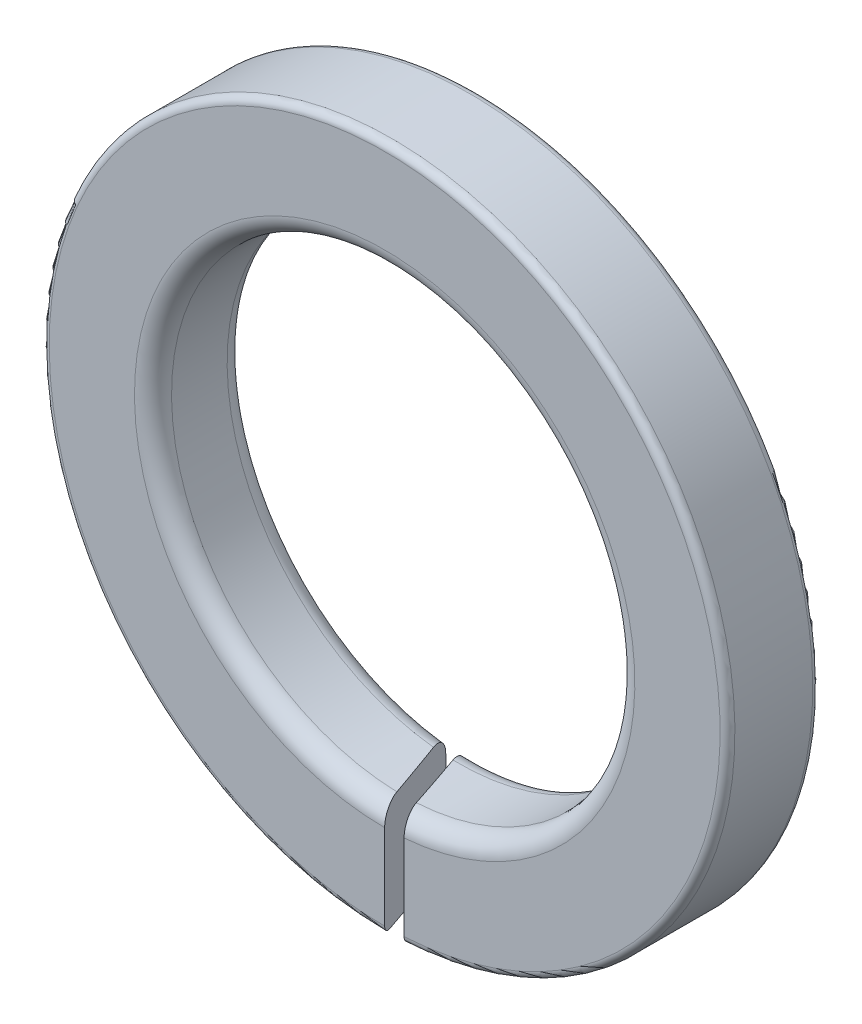
ISO-10303-21;
HEADER;
FILE_DESCRIPTION(('STEP AP214'),'2;1');
FILE_NAME('part.step','',(''),(''),'','','');
FILE_SCHEMA(('AUTOMOTIVE_DESIGN { 1 0 10303 214 1 1 1 1 }'));
ENDSEC;
DATA;
#1=APPLICATION_CONTEXT('core data for automotive mechanical design processes');
#2=APPLICATION_PROTOCOL_DEFINITION('international standard','automotive_design',2000,#1);
#3=PRODUCT_CONTEXT('',#1,'mechanical');
#4=PRODUCT('Part','Part','',(#3));
#5=PRODUCT_RELATED_PRODUCT_CATEGORY('part','',(#4));
#6=PRODUCT_DEFINITION_FORMATION('','',#4);
#7=PRODUCT_DEFINITION_CONTEXT('part definition',#1,'design');
#8=PRODUCT_DEFINITION('design','',#6,#7);
#9=PRODUCT_DEFINITION_SHAPE('','',#8);
#10=(LENGTH_UNIT() NAMED_UNIT(*) SI_UNIT(.MILLI.,.METRE.));
#11=(NAMED_UNIT(*) PLANE_ANGLE_UNIT() SI_UNIT($,.RADIAN.));
#12=(NAMED_UNIT(*) SI_UNIT($,.STERADIAN.) SOLID_ANGLE_UNIT());
#13=UNCERTAINTY_MEASURE_WITH_UNIT(LENGTH_MEASURE(1.E-05),#10,'distance_accuracy_value','');
#14=(GEOMETRIC_REPRESENTATION_CONTEXT(3) GLOBAL_UNCERTAINTY_ASSIGNED_CONTEXT((#13)) GLOBAL_UNIT_ASSIGNED_CONTEXT((#10,
#11,#12)) REPRESENTATION_CONTEXT('',''));
#15=CARTESIAN_POINT('',(0.,0.,0.));
#16=DIRECTION('',(0.,0.,1.));
#17=DIRECTION('',(1.,0.,0.));
#18=AXIS2_PLACEMENT_3D('',#15,#16,#17);
#19=CARTESIAN_POINT('',(0.,0.,2.5));
#20=DIRECTION('',(0.,0.,1.));
#21=DIRECTION('',(1.,0.,0.));
#22=AXIS2_PLACEMENT_3D('',#19,#20,#21);
#23=PLANE('',#22);
#24=DIRECTION('',(0.,1.,0.));
#25=VECTOR('',#24,1.);
#26=CARTESIAN_POINT('',(0.524617444503619,-9.25,2.5));
#27=LINE('',#26,#25);
#28=CARTESIAN_POINT('',(0.524617444503619,-9.03478148805617,2.5));
#29=VERTEX_POINT('',#28);
#30=CARTESIAN_POINT('',(0.524617444503619,-6.72958219631223,2.5));
#31=VERTEX_POINT('',#30);
#32=EDGE_CURVE('E107',#29,#31,#27,.T.);
#33=ORIENTED_EDGE('',*,*,#32,.F.);
#34=CARTESIAN_POINT('',(0.,0.,2.5));
#35=DIRECTION('',(0.,0.,1.));
#36=DIRECTION('',(1.,0.,0.));
#37=AXIS2_PLACEMENT_3D('',#34,#35,#36);
#38=CIRCLE('',#37,9.05);
#39=CARTESIAN_POINT('',(0.,-9.05,2.5));
#40=VERTEX_POINT('',#39);
#41=EDGE_CURVE('E169',#29,#40,#38,.T.);
#42=ORIENTED_EDGE('',*,*,#41,.T.);
#43=DIRECTION('',(0.,1.,0.));
#44=VECTOR('',#43,1.);
#45=CARTESIAN_POINT('',(0.,-9.25,2.5));
#46=LINE('',#45,#44);
#47=CARTESIAN_POINT('',(0.,-6.75,2.5));
#48=VERTEX_POINT('',#47);
#49=EDGE_CURVE('E204',#40,#48,#46,.T.);
#50=ORIENTED_EDGE('',*,*,#49,.T.);
#51=CARTESIAN_POINT('',(0.,0.,2.5));
#52=DIRECTION('',(0.,0.,1.));
#53=DIRECTION('',(1.,0.,0.));
#54=AXIS2_PLACEMENT_3D('',#51,#52,#53);
#55=CIRCLE('',#54,6.75);
#56=EDGE_CURVE('E202',#48,#31,#55,.F.);
#57=ORIENTED_EDGE('',*,*,#56,.T.);
#58=EDGE_LOOP('',(#33,#42,#50,#57));
#59=FACE_BOUND('',#58,.T.);
#60=ADVANCED_FACE('F36',(#59),#23,.T.);
#61=CARTESIAN_POINT('',(0.,0.,0.));
#62=DIRECTION('',(0.,0.,1.));
#63=DIRECTION('',(1.,0.,0.));
#64=AXIS2_PLACEMENT_3D('',#61,#62,#63);
#65=PLANE('',#64);
#66=DIRECTION('',(0.,1.,0.));
#67=VECTOR('',#66,1.);
#68=CARTESIAN_POINT('',(-0.851663401323122,-9.25,0.));
#69=LINE('',#68,#67);
#70=CARTESIAN_POINT('',(-0.851663401323122,-9.00983737094331,0.));
#71=VERTEX_POINT('',#70);
#72=CARTESIAN_POINT('',(-0.851663401323122,-6.69605626102759,0.));
#73=VERTEX_POINT('',#72);
#74=EDGE_CURVE('E234',#71,#73,#69,.T.);
#75=ORIENTED_EDGE('',*,*,#74,.F.);
#76=CARTESIAN_POINT('',(0.,0.,0.));
#77=DIRECTION('',(0.,0.,1.));
#78=DIRECTION('',(1.,0.,0.));
#79=AXIS2_PLACEMENT_3D('',#76,#77,#78);
#80=CIRCLE('',#79,9.05);
#81=CARTESIAN_POINT('',(-0.327045956819503,-9.04408872922684,0.));
#82=VERTEX_POINT('',#81);
#83=EDGE_CURVE('E11',#71,#82,#80,.F.);
#84=ORIENTED_EDGE('',*,*,#83,.T.);
#85=DIRECTION('',(0.,1.,0.));
#86=VECTOR('',#85,1.);
#87=CARTESIAN_POINT('',(-0.327045956819503,-9.25,0.));
#88=LINE('',#87,#86);
#89=CARTESIAN_POINT('',(-0.327045956819503,-6.74207245156324,0.));
#90=VERTEX_POINT('',#89);
#91=EDGE_CURVE('E203',#82,#90,#88,.T.);
#92=ORIENTED_EDGE('',*,*,#91,.T.);
#93=CARTESIAN_POINT('',(0.,0.,0.));
#94=DIRECTION('',(0.,0.,1.));
#95=DIRECTION('',(1.,0.,0.));
#96=AXIS2_PLACEMENT_3D('',#93,#94,#95);
#97=CIRCLE('',#96,6.75);
#98=EDGE_CURVE('E112',#90,#73,#97,.T.);
#99=ORIENTED_EDGE('',*,*,#98,.T.);
#100=EDGE_LOOP('',(#75,#84,#92,#99));
#101=FACE_BOUND('',#100,.T.);
#102=ADVANCED_FACE('F226',(#101),#65,.F.);
#103=CARTESIAN_POINT('',(0.,0.,2.5));
#104=DIRECTION('',(0.,0.,-1.));
#105=DIRECTION('',(-1.,0.,0.));
#106=AXIS2_PLACEMENT_3D('',#103,#104,#105);
#107=CYLINDRICAL_SURFACE('',#106,9.25);
#108=CARTESIAN_POINT('',(0.,0.,2.5));
#109=DIRECTION('',(-0.946580627851337,0.,0.322467230856978));
#110=DIRECTION('',(-0.322467230856978,0.,-0.946580627851337));
#111=AXIS2_PLACEMENT_3D('',#108,#109,#110);
#112=ELLIPSE('',#111,28.6850852268539,9.25);
#113=CARTESIAN_POINT('',(-0.783530329217273,-9.21675540649727,0.199999999999998));
#114=VERTEX_POINT('',#113);
#115=CARTESIAN_POINT('',(-0.0681330721058493,-9.24974907143353,2.3));
#116=VERTEX_POINT('',#115);
#117=EDGE_CURVE('E242',#114,#116,#112,.T.);
#118=ORIENTED_EDGE('',*,*,#117,.T.);
#119=CARTESIAN_POINT('',(0.,0.,2.3));
#120=DIRECTION('',(0.,0.,1.));
#121=DIRECTION('',(1.,0.,0.));
#122=AXIS2_PLACEMENT_3D('',#119,#120,#121);
#123=CIRCLE('',#122,9.25);
#124=CARTESIAN_POINT('',(0.45648437239777,-9.2387294590629,2.3));
#125=VERTEX_POINT('',#124);
#126=EDGE_CURVE('E189',#116,#125,#123,.F.);
#127=ORIENTED_EDGE('',*,*,#126,.T.);
#128=CARTESIAN_POINT('',(0.,0.,0.960021166553044));
#129=DIRECTION('',(0.946580627851337,0.,-0.322467230856978));
#130=DIRECTION('',(-0.322467230856978,0.,-0.946580627851337));
#131=AXIS2_PLACEMENT_3D('',#128,#129,#130);
#132=ELLIPSE('',#131,28.6850852268539,9.25);
#133=CARTESIAN_POINT('',(-0.258912884713652,-9.24637572879932,0.200000000000003));
#134=VERTEX_POINT('',#133);
#135=EDGE_CURVE('E195',#125,#134,#132,.T.);
#136=ORIENTED_EDGE('',*,*,#135,.T.);
#137=CARTESIAN_POINT('',(0.,0.,0.2));
#138=DIRECTION('',(0.,0.,1.));
#139=DIRECTION('',(1.,0.,0.));
#140=AXIS2_PLACEMENT_3D('',#137,#138,#139);
#141=CIRCLE('',#140,9.25);
#142=EDGE_CURVE('E239',#134,#114,#141,.T.);
#143=ORIENTED_EDGE('',*,*,#142,.T.);
#144=EDGE_LOOP('',(#118,#127,#136,#143));
#145=FACE_BOUND('',#144,.T.);
#146=ADVANCED_FACE('F38',(#145),#107,.T.);
#147=CARTESIAN_POINT('',(0.,0.,2.5));
#148=DIRECTION('',(0.,0.,-1.));
#149=DIRECTION('',(-1.,0.,0.));
#150=AXIS2_PLACEMENT_3D('',#147,#148,#149);
#151=CYLINDRICAL_SURFACE('',#150,6.25);
#152=CARTESIAN_POINT('',(0.,0.,0.960021166553044));
#153=DIRECTION('',(0.946580627851337,0.,-0.322467230856978));
#154=DIRECTION('',(-0.322467230856978,0.,-0.946580627851337));
#155=AXIS2_PLACEMENT_3D('',#152,#153,#154);
#156=ELLIPSE('',#155,19.3818143424689,6.25);
#157=CARTESIAN_POINT('',(0.354284764238996,-6.23995050507839,2.));
#158=VERTEX_POINT('',#157);
#159=CARTESIAN_POINT('',(-0.156713276554875,-6.24803496700774,0.50000000000001));
#160=VERTEX_POINT('',#159);
#161=EDGE_CURVE('E104',#158,#160,#156,.T.);
#162=ORIENTED_EDGE('',*,*,#161,.F.);
#163=CARTESIAN_POINT('',(0.,0.,2.));
#164=DIRECTION('',(0.,0.,1.));
#165=DIRECTION('',(1.,0.,0.));
#166=AXIS2_PLACEMENT_3D('',#163,#164,#165);
#167=CIRCLE('',#166,6.25);
#168=CARTESIAN_POINT('',(-0.170332680264625,-6.24767851109785,2.));
#169=VERTEX_POINT('',#168);
#170=EDGE_CURVE('E119',#158,#169,#167,.T.);
#171=ORIENTED_EDGE('',*,*,#170,.T.);
#172=CARTESIAN_POINT('',(0.,0.,2.5));
#173=DIRECTION('',(-0.946580627851337,0.,0.322467230856978));
#174=DIRECTION('',(-0.322467230856978,0.,-0.946580627851337));
#175=AXIS2_PLACEMENT_3D('',#172,#173,#174);
#176=ELLIPSE('',#175,19.3818143424689,6.25);
#177=CARTESIAN_POINT('',(-0.681330721058498,-6.21275208329947,0.499999999999998));
#178=VERTEX_POINT('',#177);
#179=EDGE_CURVE('E123',#178,#169,#176,.T.);
#180=ORIENTED_EDGE('',*,*,#179,.F.);
#181=CARTESIAN_POINT('',(0.,0.,0.5));
#182=DIRECTION('',(0.,0.,1.));
#183=DIRECTION('',(1.,0.,0.));
#184=AXIS2_PLACEMENT_3D('',#181,#182,#183);
#185=CIRCLE('',#184,6.25);
#186=EDGE_CURVE('E122',#178,#160,#185,.F.);
#187=ORIENTED_EDGE('',*,*,#186,.T.);
#188=EDGE_LOOP('',(#162,#171,#180,#187));
#189=FACE_BOUND('',#188,.T.);
#190=ADVANCED_FACE('F117',(#189),#151,.F.);
#191=CARTESIAN_POINT('',(-0.851663401323122,-9.25,0.));
#192=DIRECTION('',(-0.946580627851337,0.,0.322467230856978));
#193=DIRECTION('',(0.322467230856979,0.,0.946580627851338));
#194=AXIS2_PLACEMENT_3D('',#191,#192,#193);
#195=PLANE('',#194);
#196=ORIENTED_EDGE('',*,*,#49,.F.);
#197=CARTESIAN_POINT('',(0.,-9.05,2.5));
#198=CARTESIAN_POINT('',(3.84626203385677E-06,-9.06081658973056,2.50001129044065));
#199=CARTESIAN_POINT('',(-0.000298673406654531,-9.07162685317387,2.49912326452507));
#200=CARTESIAN_POINT('',(-0.00148666765847935,-9.09291094355386,2.4956359881845));
#201=CARTESIAN_POINT('',(-0.00237083922660226,-9.10338546773585,2.49304056267148));
#202=CARTESIAN_POINT('',(-0.00469255539461856,-9.12372487883321,2.48622532274098));
#203=CARTESIAN_POINT('',(-0.00613007887009433,-9.13358978900413,2.4820055703328));
#204=CARTESIAN_POINT('',(-0.00950739280147847,-9.15245493352137,2.47209169495041));
#205=CARTESIAN_POINT('',(-0.0114473033244932,-9.1614549604605,2.46639721952737));
#206=CARTESIAN_POINT('',(-0.0158147317921121,-9.17855935605624,2.45357693025336));
#207=CARTESIAN_POINT('',(-0.018252056380217,-9.18663960575474,2.44642232966727));
#208=CARTESIAN_POINT('',(-0.023511328941139,-9.20148943575388,2.43098409270431));
#209=CARTESIAN_POINT('',(-0.0263333688673704,-9.20825870176827,2.42270018640445));
#210=CARTESIAN_POINT('',(-0.0324292935207493,-9.2206479200757,2.40480601411788));
#211=CARTESIAN_POINT('',(-0.0357185772913832,-9.22619494620217,2.39515054528617));
#212=CARTESIAN_POINT('',(-0.0425410441299861,-9.23558765415504,2.37512365782099));
#213=CARTESIAN_POINT('',(-0.0460742652069333,-9.23943307015109,2.36475212761475));
#214=CARTESIAN_POINT('',(-0.0526903190988303,-9.24486127458708,2.3453311513182));
#215=CARTESIAN_POINT('',(-0.0557505396762726,-9.24671371571956,2.33634808191341));
#216=CARTESIAN_POINT('',(-0.0619182262482359,-9.24916921129502,2.31824325739476));
#217=CARTESIAN_POINT('',(-0.0650256180626781,-9.24977405659667,2.30912172003148));
#218=CARTESIAN_POINT('',(-0.0681330721058496,-9.24974907143353,2.3));
#219=B_SPLINE_CURVE_WITH_KNOTS('',3,(#197,#198,#199,#200,#201,#202,#203,#204,#205,#206,#207,
#208,#209,#210,#211,#212,#213,#214,#215,#216,#217,#218),.UNSPECIFIED.,.F.,.F.,(4,2,2,2,2,2,2,2,
2,2,4),(0.,0.0323994461665181,0.0647265572207657,0.0970524342977352,0.129386044181754,
0.162432456500028,0.195486781358763,0.230167269305285,0.264853173224709,0.293780485235244,
0.322666244621161),.UNSPECIFIED.);
#220=EDGE_CURVE('E168',#40,#116,#219,.T.);
#221=ORIENTED_EDGE('',*,*,#220,.T.);
#222=ORIENTED_EDGE('',*,*,#117,.F.);
#223=CARTESIAN_POINT('',(-0.783530329217272,-9.21675540649727,0.2));
#224=CARTESIAN_POINT('',(-0.787584399661463,-9.21641760769768,0.188099551894879));
#225=CARTESIAN_POINT('',(-0.791627536580417,-9.21499890418691,0.17623119840959));
#226=CARTESIAN_POINT('',(-0.799580741235186,-9.21008887442977,0.152885106977185));
#227=CARTESIAN_POINT('',(-0.80349081537949,-9.20659764814879,0.141407350218385));
#228=CARTESIAN_POINT('',(-0.811068577272666,-9.19762996723691,0.119163345481878));
#229=CARTESIAN_POINT('',(-0.814736170215186,-9.19215274147525,0.108397375801773));
#230=CARTESIAN_POINT('',(-0.821718949713024,-9.17935289572305,0.0878999014269511));
#231=CARTESIAN_POINT('',(-0.825034239331145,-9.17203081755025,0.0781680941983853));
#232=CARTESIAN_POINT('',(-0.831180873707583,-9.15579387563494,0.0601250669681185));
#233=CARTESIAN_POINT('',(-0.834016257958408,-9.14689374734219,0.0518019893108532));
#234=CARTESIAN_POINT('',(-0.839140617227901,-9.12768229078896,0.0367597811405463));
#235=CARTESIAN_POINT('',(-0.841429493414287,-9.11737070780612,0.0300409407429508));
#236=CARTESIAN_POINT('',(-0.845285567970024,-9.09609059431689,0.0187216961043222));
#237=CARTESIAN_POINT('',(-0.84687901365524,-9.08516777169935,0.0140442446524327));
#238=CARTESIAN_POINT('',(-0.849409074600066,-9.06262330671938,0.00661742279741413));
#239=CARTESIAN_POINT('',(-0.850346920621969,-9.05100301850922,0.00386443957527068));
#240=CARTESIAN_POINT('',(-0.85117609618528,-9.03436434308488,0.00143045109454141));
#241=CARTESIAN_POINT('',(-0.851358592409591,-9.02947279300064,0.000894745838135785));
#242=CARTESIAN_POINT('',(-0.85160213031802,-9.01966753346741,0.000179856868941361));
#243=CARTESIAN_POINT('',(-0.851663339481587,-9.01475386397859,1.81531620778179E-07));
#244=CARTESIAN_POINT('',(-0.851663401323127,-9.00983737094332,0.));
#245=B_SPLINE_CURVE_WITH_KNOTS('',3,(#223,#224,#225,#226,#227,#228,#229,#230,#231,#232,#233,
#234,#235,#236,#237,#238,#239,#240,#241,#242,#243,#244),.UNSPECIFIED.,.F.,.F.,(4,2,2,2,2,2,2,2,
2,2,4),(0.,0.0376783899107723,0.0753549626020129,0.113046180176563,0.150726341032353,
0.18807159290389,0.225423593304784,0.261208613713494,0.296926272896742,0.311686995265041,
0.326427321020925),.UNSPECIFIED.);
#246=EDGE_CURVE('E161',#114,#71,#245,.T.);
#247=ORIENTED_EDGE('',*,*,#246,.T.);
#248=ORIENTED_EDGE('',*,*,#74,.T.);
#249=CARTESIAN_POINT('',(-0.851663401323122,-6.69605626102759,0.));
#250=CARTESIAN_POINT('',(-0.851673065230849,-6.66948466332549,-2.83677439702207E-05));
#251=CARTESIAN_POINT('',(-0.850953815272525,-6.64291064730344,0.00208294159844885));
#252=CARTESIAN_POINT('',(-0.848097586252738,-6.59053101955503,0.0104672076575222));
#253=CARTESIAN_POINT('',(-0.845961907772209,-6.56472472558905,0.0167363466072826));
#254=CARTESIAN_POINT('',(-0.840310063394061,-6.51457807439103,0.0333269514441454));
#255=CARTESIAN_POINT('',(-0.836792564583343,-6.49023915882766,0.0436523300070073));
#256=CARTESIAN_POINT('',(-0.828486127469023,-6.44375769512151,0.0680353113040064));
#257=CARTESIAN_POINT('',(-0.823697522571057,-6.42161457312052,0.0820919353485704));
#258=CARTESIAN_POINT('',(-0.813015731335827,-6.38017613894626,0.113447607139312));
#259=CARTESIAN_POINT('',(-0.80712596881258,-6.360872322311,0.130736604512269));
#260=CARTESIAN_POINT('',(-0.794414893727388,-6.32548649434334,0.168049101049763));
#261=CARTESIAN_POINT('',(-0.78759342973774,-6.30940500778057,0.188073044720027));
#262=CARTESIAN_POINT('',(-0.772978850024946,-6.28030542566998,0.230973149650242));
#263=CARTESIAN_POINT('',(-0.765160890261641,-6.26740759225422,0.253922238900639));
#264=CARTESIAN_POINT('',(-0.748963734714587,-6.24559332621298,0.301467887574433));
#265=CARTESIAN_POINT('',(-0.740584180725064,-6.23667946304703,0.326065498486514));
#266=CARTESIAN_POINT('',(-0.723771506938266,-6.22316080939867,0.37541795909677));
#267=CARTESIAN_POINT('',(-0.715349408943099,-6.21842273943022,0.400140455044356));
#268=CARTESIAN_POINT('',(-0.698386697002888,-6.21274970340703,0.449933342451102));
#269=CARTESIAN_POINT('',(-0.689846304050416,-6.21180841016573,0.475003085201592));
#270=CARTESIAN_POINT('',(-0.681330721058497,-6.21275208329947,0.5));
#271=B_SPLINE_CURVE_WITH_KNOTS('',3,(#249,#250,#251,#252,#253,#254,#255,#256,#257,#258,#259,
#260,#261,#262,#263,#264,#265,#266,#267,#268,#269,#270),.UNSPECIFIED.,.F.,.F.,(4,2,2,2,2,2,2,2,
2,2,4),(0.,0.0796240513762665,0.159175092068307,0.238803057392262,0.318410157247913,
0.397773732658348,0.477150222265913,0.559177982718713,0.641258570859576,0.720613123141098,
0.799835379254026),.UNSPECIFIED.);
#272=EDGE_CURVE('E128',#73,#178,#271,.T.);
#273=ORIENTED_EDGE('',*,*,#272,.T.);
#274=ORIENTED_EDGE('',*,*,#179,.T.);
#275=CARTESIAN_POINT('',(-0.170332680264624,-6.24767851109785,2.));
#276=CARTESIAN_POINT('',(-0.160218891275009,-6.24793898238693,2.02968833982388));
#277=CARTESIAN_POINT('',(-0.150112153363274,-6.25084969133645,2.05935598168812));
#278=CARTESIAN_POINT('',(-0.130183773767033,-6.26183826480643,2.11785438482861));
#279=CARTESIAN_POINT('',(-0.120362457747745,-6.26992180682495,2.14668419013676));
#280=CARTESIAN_POINT('',(-0.101289980190851,-6.29113201851125,2.20267015104356));
#281=CARTESIAN_POINT('',(-0.0920393914992691,-6.30426366244121,2.22982462509168));
#282=CARTESIAN_POINT('',(-0.0744143613880735,-6.33528941482184,2.28156170245057));
#283=CARTESIAN_POINT('',(-0.0660393202686615,-6.3531802333431,2.30614606613932));
#284=CARTESIAN_POINT('',(-0.0506800341255474,-6.3927240841462,2.35123220615441));
#285=CARTESIAN_POINT('',(-0.0436622063309966,-6.41425140506027,2.37183256242089));
#286=CARTESIAN_POINT('',(-0.0309800168686645,-6.46086721013095,2.40906026717675));
#287=CARTESIAN_POINT('',(-0.0253156500471155,-6.48595568072669,2.42568763079467));
#288=CARTESIAN_POINT('',(-0.0158665598025441,-6.53736150870502,2.45342479265314));
#289=CARTESIAN_POINT('',(-0.0119900619462398,-6.5635169665749,2.46480398850176));
#290=CARTESIAN_POINT('',(-0.00580110320629099,-6.61753201404825,2.48297125602298));
#291=CARTESIAN_POINT('',(-0.00348622624100318,-6.64538889810049,2.48976641993895));
#292=CARTESIAN_POINT('',(-0.00133323734614803,-6.68626120522165,2.49608637243283));
#293=CARTESIAN_POINT('',(-0.000833361762064048,-6.69896946248295,2.4975537232175));
#294=CARTESIAN_POINT('',(-0.000167046022413883,-6.72444959145694,2.49950964776062));
#295=CARTESIAN_POINT('',(-8.14869887736955E-08,-6.73722133130906,2.49999976080049));
#296=CARTESIAN_POINT('',(0.,-6.75,2.50000000000003));
#297=B_SPLINE_CURVE_WITH_KNOTS('',3,(#275,#276,#277,#278,#279,#280,#281,#282,#283,#284,#285,
#286,#287,#288,#289,#290,#291,#292,#293,#294,#295,#296),.UNSPECIFIED.,.F.,.F.,(4,2,2,2,2,2,2,2,
2,2,4),(0.,0.0939885930814002,0.188080521690172,0.282265404566422,0.376385347611813,
0.467745240165372,0.559104784829204,0.645029275762807,0.730820520753186,0.769192815779287,
0.807504621360237),.UNSPECIFIED.);
#298=EDGE_CURVE('E127',#169,#48,#297,.T.);
#299=ORIENTED_EDGE('',*,*,#298,.T.);
#300=EDGE_LOOP('',(#196,#221,#222,#247,#248,#273,#274,#299));
#301=FACE_BOUND('',#300,.T.);
#302=ADVANCED_FACE('F148',(#301),#195,.F.);
#303=CARTESIAN_POINT('',(0.524617444503619,-9.25,2.5));
#304=DIRECTION('',(0.946580627851337,0.,-0.322467230856978));
#305=DIRECTION('',(-0.322467230856979,0.,-0.946580627851338));
#306=AXIS2_PLACEMENT_3D('',#303,#304,#305);
#307=PLANE('',#306);
#308=ORIENTED_EDGE('',*,*,#135,.F.);
#309=CARTESIAN_POINT('',(0.456484372397769,-9.2387294590629,2.3));
#310=CARTESIAN_POINT('',(0.460513658253945,-9.23853743711168,2.3118276946324));
#311=CARTESIAN_POINT('',(0.464536805223244,-9.23727889253477,2.32363736897983));
#312=CARTESIAN_POINT('',(0.472460745011501,-9.23270096339545,2.34689755538664));
#313=CARTESIAN_POINT('',(0.476361496451236,-9.22938088959642,2.35834794598014));
#314=CARTESIAN_POINT('',(0.483930198748157,-9.22074951096148,2.38056535688791));
#315=CARTESIAN_POINT('',(0.487597995647873,-9.21543690496755,2.39133192527049));
#316=CARTESIAN_POINT('',(0.494586458402564,-9.20294935031799,2.41184608245934));
#317=CARTESIAN_POINT('',(0.497907274231147,-9.19577521097178,2.42159411150293));
#318=CARTESIAN_POINT('',(0.504043486051758,-9.17987153371836,2.43960654402931));
#319=CARTESIAN_POINT('',(0.506866347806736,-9.1711697509408,2.44789286275157));
#320=CARTESIAN_POINT('',(0.511974060959945,-9.15235295419374,2.46288620737949));
#321=CARTESIAN_POINT('',(0.514258847965747,-9.14223777131049,2.46959304426555));
#322=CARTESIAN_POINT('',(0.5181067614915,-9.12138520092204,2.48088833275563));
#323=CARTESIAN_POINT('',(0.519698446656061,-9.11069843879701,2.48556061631885));
#324=CARTESIAN_POINT('',(0.522241214517227,-9.08862410224314,2.49302473846269));
#325=CARTESIAN_POINT('',(0.523193383572135,-9.07723775232461,2.49581976597423));
#326=CARTESIAN_POINT('',(0.52407442027949,-9.0605801739747,2.49840598931666));
#327=CARTESIAN_POINT('',(0.5242778475703,-9.05543712725654,2.49900313629542));
#328=CARTESIAN_POINT('',(0.524549245605312,-9.04512417175188,2.49979980677166));
#329=CARTESIAN_POINT('',(0.524617408664686,-9.03995431159591,2.49999989479725));
#330=CARTESIAN_POINT('',(0.524617444503627,-9.03478148805617,2.50000000000002));
#331=B_SPLINE_CURVE_WITH_KNOTS('',3,(#309,#310,#311,#312,#313,#314,#315,#316,#317,#318,#319,
#320,#321,#322,#323,#324,#325,#326,#327,#328,#329,#330),.UNSPECIFIED.,.F.,.F.,(4,2,2,2,2,2,2,2,
2,2,4),(0.,0.0374428617147856,0.0748982485480395,0.112378137104517,0.149841758344749,
0.186684348138648,0.223531344717408,0.258669171810009,0.293747157605349,0.309277628114828,
0.324786001939202),.UNSPECIFIED.);
#332=EDGE_CURVE('E44',#125,#29,#331,.T.);
#333=ORIENTED_EDGE('',*,*,#332,.T.);
#334=ORIENTED_EDGE('',*,*,#32,.T.);
#335=CARTESIAN_POINT('',(0.524617444503619,-6.72958219631223,2.5));
#336=CARTESIAN_POINT('',(0.524627275853258,-6.70290996796196,2.50002885925832));
#337=CARTESIAN_POINT('',(0.523895362724366,-6.67624247423452,2.49788037803981));
#338=CARTESIAN_POINT('',(0.521001959032705,-6.62370529148539,2.48938698825939));
#339=CARTESIAN_POINT('',(0.518842661952388,-6.59783444198995,2.48304851851606));
#340=CARTESIAN_POINT('',(0.513146514653541,-6.54757842431998,2.46632786546816));
#341=CARTESIAN_POINT('',(0.509608892285512,-6.52319409777873,2.45594341557125));
#342=CARTESIAN_POINT('',(0.501273869847899,-6.47659941018425,2.43147652400158));
#343=CARTESIAN_POINT('',(0.496476525266958,-6.45438895343485,2.41739424521195));
#344=CARTESIAN_POINT('',(0.48573454503144,-6.41254263410177,2.38586189270382));
#345=CARTESIAN_POINT('',(0.479781328581114,-6.3929279972547,2.3683866306429));
#346=CARTESIAN_POINT('',(0.466937126940335,-6.35691856480528,2.33068335015432));
#347=CARTESIAN_POINT('',(0.460045941341675,-6.34052445914146,2.31045474344199));
#348=CARTESIAN_POINT('',(0.445205553560851,-6.31062929821427,2.26689179428341));
#349=CARTESIAN_POINT('',(0.437223183737339,-6.29728685685764,2.24346009048144));
#350=CARTESIAN_POINT('',(0.420677429429484,-6.27467215456572,2.19489115385064));
#351=CARTESIAN_POINT('',(0.41211377343786,-6.26540181094147,2.16975312403064));
#352=CARTESIAN_POINT('',(0.395374835660083,-6.2516622024859,2.12061711046069));
#353=CARTESIAN_POINT('',(0.387228251392129,-6.24685231775905,2.09670336632393));
#354=CARTESIAN_POINT('',(0.370812066526426,-6.24076137465322,2.04851477197962));
#355=CARTESIAN_POINT('',(0.362542685845931,-6.23947462981768,2.02424056732421));
#356=CARTESIAN_POINT('',(0.354284764238995,-6.2399505050784,2.));
#357=B_SPLINE_CURVE_WITH_KNOTS('',3,(#335,#336,#337,#338,#339,#340,#341,#342,#343,#344,#345,
#346,#347,#348,#349,#350,#351,#352,#353,#354,#355,#356),.UNSPECIFIED.,.F.,.F.,(4,2,2,2,2,2,2,2,
2,2,4),(0.,0.0799122799412285,0.15970204206836,0.239536567514829,0.319367576974605,
0.399815597638057,0.480280834034194,0.564278756361479,0.648316186081746,0.725223289627293,
0.802006189355041),.UNSPECIFIED.);
#358=EDGE_CURVE('E100',#31,#158,#357,.T.);
#359=ORIENTED_EDGE('',*,*,#358,.T.);
#360=ORIENTED_EDGE('',*,*,#161,.T.);
#361=CARTESIAN_POINT('',(-0.156713276554878,-6.24803496700774,0.5));
#362=CARTESIAN_POINT('',(-0.166704113620613,-6.24776788673806,0.470672577187732));
#363=CARTESIAN_POINT('',(-0.176704682702217,-6.25009024844255,0.441316586704675));
#364=CARTESIAN_POINT('',(-0.196459533735234,-6.25984023765863,0.383327564861286));
#365=CARTESIAN_POINT('',(-0.206213395705355,-6.26727603351975,0.354695766327475));
#366=CARTESIAN_POINT('',(-0.225188350590023,-6.28719333721801,0.298996076593277));
#367=CARTESIAN_POINT('',(-0.234408690575814,-6.29968178618519,0.27193039556405));
#368=CARTESIAN_POINT('',(-0.251997534288604,-6.32946218056227,0.220299540916944));
#369=CARTESIAN_POINT('',(-0.260366798330455,-6.3467497861765,0.195732135446516));
#370=CARTESIAN_POINT('',(-0.275658722749452,-6.38497855060028,0.150843731191856));
#371=CARTESIAN_POINT('',(-0.28262489800668,-6.40575201327949,0.130394997436227));
#372=CARTESIAN_POINT('',(-0.295244713764236,-6.45084817672841,0.0933503864492165));
#373=CARTESIAN_POINT('',(-0.300898423141853,-6.47517069113723,0.0767543070332344));
#374=CARTESIAN_POINT('',(-0.310366162890154,-6.52504725192872,0.0489624008247735));
#375=CARTESIAN_POINT('',(-0.314271590713318,-6.55043488603775,0.0374982830257203));
#376=CARTESIAN_POINT('',(-0.320578981238506,-6.60293313521263,0.0189833670524926));
#377=CARTESIAN_POINT('',(-0.322982772893499,-6.63004160981153,0.0119272001112511));
#378=CARTESIAN_POINT('',(-0.325411125306388,-6.67151470551495,0.00479893673537818));
#379=CARTESIAN_POINT('',(-0.326024409550492,-6.68557040593728,0.00299868254119978));
#380=CARTESIAN_POINT('',(-0.32684154435646,-6.71377260135228,0.000600038884861132));
#381=CARTESIAN_POINT('',(-0.327046064688704,-6.7279189096549,-3.1664270523275E-07));
#382=CARTESIAN_POINT('',(-0.327045956819526,-6.74207245156323,0.));
#383=B_SPLINE_CURVE_WITH_KNOTS('',3,(#361,#362,#363,#364,#365,#366,#367,#368,#369,#370,#371,
#372,#373,#374,#375,#376,#377,#378,#379,#380,#381,#382),.UNSPECIFIED.,.F.,.F.,(4,2,2,2,2,2,2,2,
2,2,4),(0.,0.0928601186087751,0.185868920323461,0.279005929970897,0.372058990224685,
0.461503216036324,0.550942746816007,0.634909768523753,0.718774320206363,0.761275948003478,
0.803707878489755),.UNSPECIFIED.);
#384=EDGE_CURVE('E113',#160,#90,#383,.T.);
#385=ORIENTED_EDGE('',*,*,#384,.T.);
#386=ORIENTED_EDGE('',*,*,#91,.F.);
#387=CARTESIAN_POINT('',(-0.327045956819503,-9.04408872922684,0.));
#388=CARTESIAN_POINT('',(-0.327049711012378,-9.05501092440518,-1.10201778933948E-05));
#389=CARTESIAN_POINT('',(-0.326741831437071,-9.0659247890917,0.000892739379076064));
#390=CARTESIAN_POINT('',(-0.325536248535841,-9.087407711276,0.00443164600391556));
#391=CARTESIAN_POINT('',(-0.324640024700627,-9.09797756405567,0.00706245012741532));
#392=CARTESIAN_POINT('',(-0.322291237412392,-9.11849903785477,0.0139571554904319));
#393=CARTESIAN_POINT('',(-0.320838837265845,-9.12845083935272,0.0182205773548983));
#394=CARTESIAN_POINT('',(-0.317430549552452,-9.1474887147893,0.0282253741681063));
#395=CARTESIAN_POINT('',(-0.315474488287509,-9.15657448857601,0.0339672589957975));
#396=CARTESIAN_POINT('',(-0.311059935930523,-9.17390763377586,0.0469258772425355));
#397=CARTESIAN_POINT('',(-0.308588763415919,-9.18212390060908,0.054179836115153));
#398=CARTESIAN_POINT('',(-0.303256101427073,-9.19723128812631,0.069833502753172));
#399=CARTESIAN_POINT('',(-0.300394507516279,-9.20412205304994,0.0782335170849748));
#400=CARTESIAN_POINT('',(-0.294204297873483,-9.21675685060298,0.09640445654644));
#401=CARTESIAN_POINT('',(-0.290859175749958,-9.22242306917284,0.106223835065959));
#402=CARTESIAN_POINT('',(-0.283918982508117,-9.23201621433348,0.126596300382243));
#403=CARTESIAN_POINT('',(-0.280323913476962,-9.23594315544593,0.137149381052288));
#404=CARTESIAN_POINT('',(-0.273758725531885,-9.24133929117808,0.156421043820929));
#405=CARTESIAN_POINT('',(-0.270817450437573,-9.24315282042931,0.165054956848488));
#406=CARTESIAN_POINT('',(-0.26488922793886,-9.24562912436769,0.182456850864078));
#407=CARTESIAN_POINT('',(-0.26190235164134,-9.24629353628277,0.191224623122696));
#408=CARTESIAN_POINT('',(-0.258912884713653,-9.24637572879932,0.2));
#409=B_SPLINE_CURVE_WITH_KNOTS('',3,(#387,#388,#389,#390,#391,#392,#393,#394,#395,#396,#397,
#398,#399,#400,#401,#402,#403,#404,#405,#406,#407,#408),.UNSPECIFIED.,.F.,.F.,(4,2,2,2,2,2,2,2,
2,2,4),(0.,0.0327123175187046,0.0653426879016879,0.0979634845761696,0.130595546319435,
0.164153532861157,0.197720513728145,0.233024888396055,0.268328968293082,0.296158153638283,
0.323947656030034),.UNSPECIFIED.);
#410=EDGE_CURVE('E56',#82,#134,#409,.T.);
#411=ORIENTED_EDGE('',*,*,#410,.T.);
#412=EDGE_LOOP('',(#308,#333,#334,#359,#360,#385,#386,#411));
#413=FACE_BOUND('',#412,.T.);
#414=ADVANCED_FACE('F102',(#413),#307,.F.);
#415=CARTESIAN_POINT('',(0.,0.,2.));
#416=DIRECTION('',(0.,0.,1.));
#417=DIRECTION('',(1.,0.,0.));
#418=AXIS2_PLACEMENT_3D('',#415,#416,#417);
#419=TOROIDAL_SURFACE('',#418,6.75,0.5);
#420=ORIENTED_EDGE('',*,*,#358,.F.);
#421=ORIENTED_EDGE('',*,*,#56,.F.);
#422=ORIENTED_EDGE('',*,*,#298,.F.);
#423=ORIENTED_EDGE('',*,*,#170,.F.);
#424=EDGE_LOOP('',(#420,#421,#422,#423));
#425=FACE_BOUND('',#424,.T.);
#426=ADVANCED_FACE('F125',(#425),#419,.T.);
#427=CARTESIAN_POINT('',(0.,0.,0.5));
#428=DIRECTION('',(0.,0.,1.));
#429=DIRECTION('',(1.,0.,0.));
#430=AXIS2_PLACEMENT_3D('',#427,#428,#429);
#431=TOROIDAL_SURFACE('',#430,6.75,0.5);
#432=ORIENTED_EDGE('',*,*,#384,.F.);
#433=ORIENTED_EDGE('',*,*,#186,.F.);
#434=ORIENTED_EDGE('',*,*,#272,.F.);
#435=ORIENTED_EDGE('',*,*,#98,.F.);
#436=EDGE_LOOP('',(#432,#433,#434,#435));
#437=FACE_BOUND('',#436,.T.);
#438=ADVANCED_FACE('F145',(#437),#431,.T.);
#439=CARTESIAN_POINT('',(0.,0.,2.3));
#440=DIRECTION('',(0.,0.,1.));
#441=DIRECTION('',(1.,0.,0.));
#442=AXIS2_PLACEMENT_3D('',#439,#440,#441);
#443=TOROIDAL_SURFACE('',#442,9.05,0.2);
#444=ORIENTED_EDGE('',*,*,#332,.F.);
#445=ORIENTED_EDGE('',*,*,#126,.F.);
#446=ORIENTED_EDGE('',*,*,#220,.F.);
#447=ORIENTED_EDGE('',*,*,#41,.F.);
#448=EDGE_LOOP('',(#444,#445,#446,#447));
#449=FACE_BOUND('',#448,.T.);
#450=ADVANCED_FACE('F179',(#449),#443,.T.);
#451=CARTESIAN_POINT('',(0.,0.,0.2));
#452=DIRECTION('',(0.,0.,1.));
#453=DIRECTION('',(1.,0.,0.));
#454=AXIS2_PLACEMENT_3D('',#451,#452,#453);
#455=TOROIDAL_SURFACE('',#454,9.05,0.2);
#456=ORIENTED_EDGE('',*,*,#410,.F.);
#457=ORIENTED_EDGE('',*,*,#83,.F.);
#458=ORIENTED_EDGE('',*,*,#246,.F.);
#459=ORIENTED_EDGE('',*,*,#142,.F.);
#460=EDGE_LOOP('',(#456,#457,#458,#459));
#461=FACE_BOUND('',#460,.T.);
#462=ADVANCED_FACE('F176',(#461),#455,.T.);
#463=CLOSED_SHELL('',(#60,#102,#146,#190,#302,#414,#426,#438,#450,#462));
#464=MANIFOLD_SOLID_BREP('B2',#463);
#465=ADVANCED_BREP_SHAPE_REPRESENTATION('',(#18,#464),#14);
#466=SHAPE_DEFINITION_REPRESENTATION(#9,#465);
ENDSEC;
END-ISO-10303-21;
